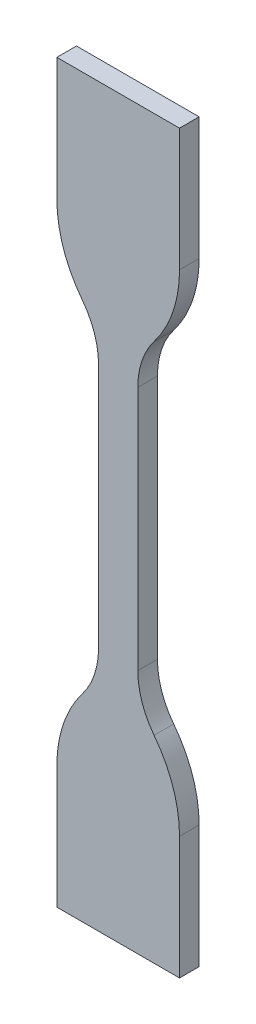
ISO-10303-21;
HEADER;
FILE_DESCRIPTION(('STEP AP214'),'2;1');
FILE_NAME('part.step','',(''),(''),'','','');
FILE_SCHEMA(('AUTOMOTIVE_DESIGN { 1 0 10303 214 1 1 1 1 }'));
ENDSEC;
DATA;
#1=APPLICATION_CONTEXT('core data for automotive mechanical design processes');
#2=APPLICATION_PROTOCOL_DEFINITION('international standard','automotive_design',2000,#1);
#3=PRODUCT_CONTEXT('',#1,'mechanical');
#4=PRODUCT('Part','Part','',(#3));
#5=PRODUCT_RELATED_PRODUCT_CATEGORY('part','',(#4));
#6=PRODUCT_DEFINITION_FORMATION('','',#4);
#7=PRODUCT_DEFINITION_CONTEXT('part definition',#1,'design');
#8=PRODUCT_DEFINITION('design','',#6,#7);
#9=PRODUCT_DEFINITION_SHAPE('','',#8);
#10=(LENGTH_UNIT() NAMED_UNIT(*) SI_UNIT(.MILLI.,.METRE.));
#11=(NAMED_UNIT(*) PLANE_ANGLE_UNIT() SI_UNIT($,.RADIAN.));
#12=(NAMED_UNIT(*) SI_UNIT($,.STERADIAN.) SOLID_ANGLE_UNIT());
#13=UNCERTAINTY_MEASURE_WITH_UNIT(LENGTH_MEASURE(1.E-05),#10,'distance_accuracy_value','');
#14=(GEOMETRIC_REPRESENTATION_CONTEXT(3) GLOBAL_UNCERTAINTY_ASSIGNED_CONTEXT((#13)) GLOBAL_UNIT_ASSIGNED_CONTEXT((#10,
#11,#12)) REPRESENTATION_CONTEXT('',''));
#15=CARTESIAN_POINT('',(0.,0.,0.));
#16=DIRECTION('',(0.,0.,1.));
#17=DIRECTION('',(1.,0.,0.));
#18=AXIS2_PLACEMENT_3D('',#15,#16,#17);
#19=CARTESIAN_POINT('',(10.,12.5,1.));
#20=DIRECTION('',(0.,0.,-1.));
#21=DIRECTION('',(-1.,0.,0.));
#22=AXIS2_PLACEMENT_3D('',#19,#20,#21);
#23=CYLINDRICAL_SURFACE('',#22,8.);
#24=CARTESIAN_POINT('',(10.,12.5,-1.));
#25=DIRECTION('',(0.,0.,-1.));
#26=DIRECTION('',(-1.,0.,0.));
#27=AXIS2_PLACEMENT_3D('',#24,#25,#26);
#28=CIRCLE('',#27,8.);
#29=CARTESIAN_POINT('',(2.,12.5,-1.));
#30=VERTEX_POINT('',#29);
#31=CARTESIAN_POINT('',(3.65853658536585,17.3770730731512,-1.));
#32=VERTEX_POINT('',#31);
#33=EDGE_CURVE('E228',#30,#32,#28,.T.);
#34=ORIENTED_EDGE('',*,*,#33,.T.);
#35=DIRECTION('',(0.,0.,-1.));
#36=VECTOR('',#35,1.);
#37=CARTESIAN_POINT('',(3.65853658536585,17.3770730731512,1.));
#38=LINE('',#37,#36);
#39=CARTESIAN_POINT('',(3.65853658536585,17.3770730731512,1.));
#40=VERTEX_POINT('',#39);
#41=EDGE_CURVE('E11',#32,#40,#38,.F.);
#42=ORIENTED_EDGE('',*,*,#41,.T.);
#43=CARTESIAN_POINT('',(10.,12.5,1.));
#44=DIRECTION('',(0.,0.,-1.));
#45=DIRECTION('',(-1.,0.,0.));
#46=AXIS2_PLACEMENT_3D('',#43,#44,#45);
#47=CIRCLE('',#46,8.);
#48=CARTESIAN_POINT('',(2.,12.5,1.));
#49=VERTEX_POINT('',#48);
#50=EDGE_CURVE('E177',#49,#40,#47,.T.);
#51=ORIENTED_EDGE('',*,*,#50,.F.);
#52=DIRECTION('',(0.,0.,-1.));
#53=VECTOR('',#52,1.);
#54=CARTESIAN_POINT('',(2.,12.5,1.));
#55=LINE('',#54,#53);
#56=EDGE_CURVE('E227',#49,#30,#55,.T.);
#57=ORIENTED_EDGE('',*,*,#56,.T.);
#58=EDGE_LOOP('',(#34,#42,#51,#57));
#59=FACE_BOUND('',#58,.T.);
#60=ADVANCED_FACE('F49',(#59),#23,.F.);
#61=CARTESIAN_POINT('',(6.25,19.5666470125513,1.));
#62=DIRECTION('',(-1.,0.,0.));
#63=DIRECTION('',(0.,0.,1.));
#64=AXIS2_PLACEMENT_3D('',#61,#62,#63);
#65=PLANE('',#64);
#66=DIRECTION('',(0.,1.,0.));
#67=VECTOR('',#66,1.);
#68=CARTESIAN_POINT('',(6.25,19.5666470125513,1.));
#69=LINE('',#68,#67);
#70=CARTESIAN_POINT('',(6.25,24.99749974995,1.));
#71=VERTEX_POINT('',#70);
#72=CARTESIAN_POINT('',(6.25,37.5,1.));
#73=VERTEX_POINT('',#72);
#74=EDGE_CURVE('E162',#71,#73,#69,.T.);
#75=ORIENTED_EDGE('',*,*,#74,.F.);
#76=DIRECTION('',(0.,0.,-1.));
#77=VECTOR('',#76,1.);
#78=CARTESIAN_POINT('',(6.25,24.99749974995,1.));
#79=LINE('',#78,#77);
#80=CARTESIAN_POINT('',(6.25,24.99749974995,-1.));
#81=VERTEX_POINT('',#80);
#82=EDGE_CURVE('E58',#71,#81,#79,.T.);
#83=ORIENTED_EDGE('',*,*,#82,.T.);
#84=DIRECTION('',(0.,1.,0.));
#85=VECTOR('',#84,1.);
#86=CARTESIAN_POINT('',(6.25,19.5666470125513,-1.));
#87=LINE('',#86,#85);
#88=CARTESIAN_POINT('',(6.25,37.5,-1.));
#89=VERTEX_POINT('',#88);
#90=EDGE_CURVE('E183',#81,#89,#87,.T.);
#91=ORIENTED_EDGE('',*,*,#90,.T.);
#92=DIRECTION('',(0.,0.,-1.));
#93=VECTOR('',#92,1.);
#94=CARTESIAN_POINT('',(6.25,37.5,1.));
#95=LINE('',#94,#93);
#96=EDGE_CURVE('E180',#73,#89,#95,.T.);
#97=ORIENTED_EDGE('',*,*,#96,.F.);
#98=EDGE_LOOP('',(#75,#83,#91,#97));
#99=FACE_BOUND('',#98,.T.);
#100=ADVANCED_FACE('F181',(#99),#65,.F.);
#101=CARTESIAN_POINT('',(6.25,37.5,1.));
#102=DIRECTION('',(0.,-1.,0.));
#103=DIRECTION('',(0.,0.,-1.));
#104=AXIS2_PLACEMENT_3D('',#101,#102,#103);
#105=PLANE('',#104);
#106=DIRECTION('',(-1.,0.,0.));
#107=VECTOR('',#106,1.);
#108=CARTESIAN_POINT('',(6.25,37.5,-1.));
#109=LINE('',#108,#107);
#110=CARTESIAN_POINT('',(-6.25,37.5,-1.));
#111=VERTEX_POINT('',#110);
#112=EDGE_CURVE('E234',#89,#111,#109,.T.);
#113=ORIENTED_EDGE('',*,*,#112,.T.);
#114=DIRECTION('',(0.,0.,-1.));
#115=VECTOR('',#114,1.);
#116=CARTESIAN_POINT('',(-6.25,37.5,1.));
#117=LINE('',#116,#115);
#118=CARTESIAN_POINT('',(-6.25,37.5,1.));
#119=VERTEX_POINT('',#118);
#120=EDGE_CURVE('E188',#119,#111,#117,.T.);
#121=ORIENTED_EDGE('',*,*,#120,.F.);
#122=DIRECTION('',(-1.,0.,0.));
#123=VECTOR('',#122,1.);
#124=CARTESIAN_POINT('',(6.25,37.5,1.));
#125=LINE('',#124,#123);
#126=EDGE_CURVE('E168',#73,#119,#125,.T.);
#127=ORIENTED_EDGE('',*,*,#126,.F.);
#128=ORIENTED_EDGE('',*,*,#96,.T.);
#129=EDGE_LOOP('',(#113,#121,#127,#128));
#130=FACE_BOUND('',#129,.T.);
#131=ADVANCED_FACE('F190',(#130),#105,.F.);
#132=CARTESIAN_POINT('',(-6.25,19.5666470125513,1.));
#133=DIRECTION('',(1.,0.,0.));
#134=DIRECTION('',(0.,0.,-1.));
#135=AXIS2_PLACEMENT_3D('',#132,#133,#134);
#136=PLANE('',#135);
#137=DIRECTION('',(0.,-1.,0.));
#138=VECTOR('',#137,1.);
#139=CARTESIAN_POINT('',(-6.25,19.5666470125513,-1.));
#140=LINE('',#139,#138);
#141=CARTESIAN_POINT('',(-6.25,24.99749974995,-1.));
#142=VERTEX_POINT('',#141);
#143=EDGE_CURVE('E237',#111,#142,#140,.T.);
#144=ORIENTED_EDGE('',*,*,#143,.T.);
#145=DIRECTION('',(0.,0.,-1.));
#146=VECTOR('',#145,1.);
#147=CARTESIAN_POINT('',(-6.25,24.99749974995,1.));
#148=LINE('',#147,#146);
#149=CARTESIAN_POINT('',(-6.25,24.99749974995,1.));
#150=VERTEX_POINT('',#149);
#151=EDGE_CURVE('E327',#142,#150,#148,.F.);
#152=ORIENTED_EDGE('',*,*,#151,.T.);
#153=DIRECTION('',(0.,-1.,0.));
#154=VECTOR('',#153,1.);
#155=CARTESIAN_POINT('',(-6.25,19.5666470125513,1.));
#156=LINE('',#155,#154);
#157=EDGE_CURVE('E194',#119,#150,#156,.T.);
#158=ORIENTED_EDGE('',*,*,#157,.F.);
#159=ORIENTED_EDGE('',*,*,#120,.T.);
#160=EDGE_LOOP('',(#144,#152,#158,#159));
#161=FACE_BOUND('',#160,.T.);
#162=ADVANCED_FACE('F339',(#161),#136,.F.);
#163=CARTESIAN_POINT('',(-10.,12.5,1.));
#164=DIRECTION('',(0.,0.,-1.));
#165=DIRECTION('',(-1.,0.,0.));
#166=AXIS2_PLACEMENT_3D('',#163,#164,#165);
#167=CYLINDRICAL_SURFACE('',#166,8.);
#168=CARTESIAN_POINT('',(-10.,12.5,1.));
#169=DIRECTION('',(0.,0.,-1.));
#170=DIRECTION('',(1.,0.,0.));
#171=AXIS2_PLACEMENT_3D('',#168,#169,#170);
#172=CIRCLE('',#171,8.);
#173=CARTESIAN_POINT('',(-3.65853658536585,17.3770730731512,1.));
#174=VERTEX_POINT('',#173);
#175=CARTESIAN_POINT('',(-2.,12.5,1.));
#176=VERTEX_POINT('',#175);
#177=EDGE_CURVE('E200',#174,#176,#172,.T.);
#178=ORIENTED_EDGE('',*,*,#177,.F.);
#179=DIRECTION('',(0.,0.,-1.));
#180=VECTOR('',#179,1.);
#181=CARTESIAN_POINT('',(-3.65853658536585,17.3770730731512,1.));
#182=LINE('',#181,#180);
#183=CARTESIAN_POINT('',(-3.65853658536585,17.3770730731512,-1.));
#184=VERTEX_POINT('',#183);
#185=EDGE_CURVE('E323',#174,#184,#182,.T.);
#186=ORIENTED_EDGE('',*,*,#185,.T.);
#187=CARTESIAN_POINT('',(-10.,12.5,-1.));
#188=DIRECTION('',(0.,0.,-1.));
#189=DIRECTION('',(1.,0.,0.));
#190=AXIS2_PLACEMENT_3D('',#187,#188,#189);
#191=CIRCLE('',#190,8.);
#192=CARTESIAN_POINT('',(-2.,12.5,-1.));
#193=VERTEX_POINT('',#192);
#194=EDGE_CURVE('E241',#184,#193,#191,.T.);
#195=ORIENTED_EDGE('',*,*,#194,.T.);
#196=DIRECTION('',(0.,0.,-1.));
#197=VECTOR('',#196,1.);
#198=CARTESIAN_POINT('',(-2.,12.5,1.));
#199=LINE('',#198,#197);
#200=EDGE_CURVE('E284',#176,#193,#199,.T.);
#201=ORIENTED_EDGE('',*,*,#200,.F.);
#202=EDGE_LOOP('',(#178,#186,#195,#201));
#203=FACE_BOUND('',#202,.T.);
#204=ADVANCED_FACE('F348',(#203),#167,.F.);
#205=CARTESIAN_POINT('',(-2.,-12.5,1.));
#206=DIRECTION('',(1.,0.,0.));
#207=DIRECTION('',(0.,1.,0.));
#208=AXIS2_PLACEMENT_3D('',#205,#206,#207);
#209=PLANE('',#208);
#210=DIRECTION('',(0.,-1.,0.));
#211=VECTOR('',#210,1.);
#212=CARTESIAN_POINT('',(-2.,-12.5,-1.));
#213=LINE('',#212,#211);
#214=CARTESIAN_POINT('',(-2.,-12.5,-1.));
#215=VERTEX_POINT('',#214);
#216=EDGE_CURVE('E243',#193,#215,#213,.T.);
#217=ORIENTED_EDGE('',*,*,#216,.T.);
#218=DIRECTION('',(0.,0.,-1.));
#219=VECTOR('',#218,1.);
#220=CARTESIAN_POINT('',(-2.,-12.5,1.));
#221=LINE('',#220,#219);
#222=CARTESIAN_POINT('',(-2.,-12.5,1.));
#223=VERTEX_POINT('',#222);
#224=EDGE_CURVE('E280',#223,#215,#221,.T.);
#225=ORIENTED_EDGE('',*,*,#224,.F.);
#226=DIRECTION('',(0.,-1.,0.));
#227=VECTOR('',#226,1.);
#228=CARTESIAN_POINT('',(-2.,-12.5,1.));
#229=LINE('',#228,#227);
#230=EDGE_CURVE('E206',#176,#223,#229,.T.);
#231=ORIENTED_EDGE('',*,*,#230,.F.);
#232=ORIENTED_EDGE('',*,*,#200,.T.);
#233=EDGE_LOOP('',(#217,#225,#231,#232));
#234=FACE_BOUND('',#233,.T.);
#235=ADVANCED_FACE('F354',(#234),#209,.F.);
#236=CARTESIAN_POINT('',(-9.99999999999999,-12.5,1.));
#237=DIRECTION('',(0.,0.,-1.));
#238=DIRECTION('',(-1.,0.,0.));
#239=AXIS2_PLACEMENT_3D('',#236,#237,#238);
#240=CYLINDRICAL_SURFACE('',#239,8.);
#241=CARTESIAN_POINT('',(-9.99999999999999,-12.5,-1.));
#242=DIRECTION('',(0.,0.,-1.));
#243=DIRECTION('',(-1.,0.,0.));
#244=AXIS2_PLACEMENT_3D('',#241,#242,#243);
#245=CIRCLE('',#244,8.);
#246=CARTESIAN_POINT('',(-3.65853658536585,-17.3770730731512,-1.));
#247=VERTEX_POINT('',#246);
#248=EDGE_CURVE('E246',#215,#247,#245,.T.);
#249=ORIENTED_EDGE('',*,*,#248,.T.);
#250=DIRECTION('',(0.,0.,-1.));
#251=VECTOR('',#250,1.);
#252=CARTESIAN_POINT('',(-3.65853658536585,-17.3770730731512,1.));
#253=LINE('',#252,#251);
#254=CARTESIAN_POINT('',(-3.65853658536585,-17.3770730731512,1.));
#255=VERTEX_POINT('',#254);
#256=EDGE_CURVE('E305',#247,#255,#253,.F.);
#257=ORIENTED_EDGE('',*,*,#256,.T.);
#258=CARTESIAN_POINT('',(-9.99999999999999,-12.5,1.));
#259=DIRECTION('',(0.,0.,-1.));
#260=DIRECTION('',(-1.,0.,0.));
#261=AXIS2_PLACEMENT_3D('',#258,#259,#260);
#262=CIRCLE('',#261,8.);
#263=EDGE_CURVE('E209',#223,#255,#262,.T.);
#264=ORIENTED_EDGE('',*,*,#263,.F.);
#265=ORIENTED_EDGE('',*,*,#224,.T.);
#266=EDGE_LOOP('',(#249,#257,#264,#265));
#267=FACE_BOUND('',#266,.T.);
#268=ADVANCED_FACE('F358',(#267),#240,.F.);
#269=CARTESIAN_POINT('',(-6.25,-19.5666470125513,1.));
#270=DIRECTION('',(1.,0.,0.));
#271=DIRECTION('',(0.,1.,0.));
#272=AXIS2_PLACEMENT_3D('',#269,#270,#271);
#273=PLANE('',#272);
#274=DIRECTION('',(0.,-1.,0.));
#275=VECTOR('',#274,1.);
#276=CARTESIAN_POINT('',(-6.25,-19.5666470125513,1.));
#277=LINE('',#276,#275);
#278=CARTESIAN_POINT('',(-6.24999999999999,-24.99749974995,1.));
#279=VERTEX_POINT('',#278);
#280=CARTESIAN_POINT('',(-6.24999999999999,-37.5,1.));
#281=VERTEX_POINT('',#280);
#282=EDGE_CURVE('E212',#279,#281,#277,.T.);
#283=ORIENTED_EDGE('',*,*,#282,.F.);
#284=DIRECTION('',(0.,0.,-1.));
#285=VECTOR('',#284,1.);
#286=CARTESIAN_POINT('',(-6.24999999999999,-24.99749974995,1.));
#287=LINE('',#286,#285);
#288=CARTESIAN_POINT('',(-6.24999999999999,-24.99749974995,-1.));
#289=VERTEX_POINT('',#288);
#290=EDGE_CURVE('E187',#279,#289,#287,.T.);
#291=ORIENTED_EDGE('',*,*,#290,.T.);
#292=DIRECTION('',(0.,-1.,0.));
#293=VECTOR('',#292,1.);
#294=CARTESIAN_POINT('',(-6.25,-19.5666470125513,-1.));
#295=LINE('',#294,#293);
#296=CARTESIAN_POINT('',(-6.24999999999999,-37.5,-1.));
#297=VERTEX_POINT('',#296);
#298=EDGE_CURVE('E250',#289,#297,#295,.T.);
#299=ORIENTED_EDGE('',*,*,#298,.T.);
#300=DIRECTION('',(0.,0.,-1.));
#301=VECTOR('',#300,1.);
#302=CARTESIAN_POINT('',(-6.24999999999999,-37.5,1.));
#303=LINE('',#302,#301);
#304=EDGE_CURVE('E276',#281,#297,#303,.T.);
#305=ORIENTED_EDGE('',*,*,#304,.F.);
#306=EDGE_LOOP('',(#283,#291,#299,#305));
#307=FACE_BOUND('',#306,.T.);
#308=ADVANCED_FACE('F366',(#307),#273,.F.);
#309=CARTESIAN_POINT('',(6.25000000000001,-37.5,1.));
#310=DIRECTION('',(0.,1.,0.));
#311=DIRECTION('',(0.,0.,1.));
#312=AXIS2_PLACEMENT_3D('',#309,#310,#311);
#313=PLANE('',#312);
#314=DIRECTION('',(1.,0.,0.));
#315=VECTOR('',#314,1.);
#316=CARTESIAN_POINT('',(6.25000000000001,-37.5,-1.));
#317=LINE('',#316,#315);
#318=CARTESIAN_POINT('',(6.25000000000001,-37.5,-1.));
#319=VERTEX_POINT('',#318);
#320=EDGE_CURVE('E253',#297,#319,#317,.T.);
#321=ORIENTED_EDGE('',*,*,#320,.T.);
#322=DIRECTION('',(0.,0.,-1.));
#323=VECTOR('',#322,1.);
#324=CARTESIAN_POINT('',(6.25000000000001,-37.5,1.));
#325=LINE('',#324,#323);
#326=CARTESIAN_POINT('',(6.25000000000001,-37.5,1.));
#327=VERTEX_POINT('',#326);
#328=EDGE_CURVE('E272',#327,#319,#325,.T.);
#329=ORIENTED_EDGE('',*,*,#328,.F.);
#330=DIRECTION('',(1.,0.,0.));
#331=VECTOR('',#330,1.);
#332=CARTESIAN_POINT('',(6.25000000000001,-37.5,1.));
#333=LINE('',#332,#331);
#334=EDGE_CURVE('E215',#281,#327,#333,.T.);
#335=ORIENTED_EDGE('',*,*,#334,.F.);
#336=ORIENTED_EDGE('',*,*,#304,.T.);
#337=EDGE_LOOP('',(#321,#329,#335,#336));
#338=FACE_BOUND('',#337,.T.);
#339=ADVANCED_FACE('F372',(#338),#313,.F.);
#340=CARTESIAN_POINT('',(6.25000000000001,-19.5666470125513,1.));
#341=DIRECTION('',(-1.,0.,0.));
#342=DIRECTION('',(0.,-1.,0.));
#343=AXIS2_PLACEMENT_3D('',#340,#341,#342);
#344=PLANE('',#343);
#345=DIRECTION('',(0.,1.,0.));
#346=VECTOR('',#345,1.);
#347=CARTESIAN_POINT('',(6.25000000000001,-19.5666470125513,-1.));
#348=LINE('',#347,#346);
#349=CARTESIAN_POINT('',(6.25000000000001,-24.99749974995,-1.));
#350=VERTEX_POINT('',#349);
#351=EDGE_CURVE('E256',#319,#350,#348,.T.);
#352=ORIENTED_EDGE('',*,*,#351,.T.);
#353=DIRECTION('',(0.,0.,-1.));
#354=VECTOR('',#353,1.);
#355=CARTESIAN_POINT('',(6.25000000000001,-24.99749974995,1.));
#356=LINE('',#355,#354);
#357=CARTESIAN_POINT('',(6.25000000000001,-24.99749974995,1.));
#358=VERTEX_POINT('',#357);
#359=EDGE_CURVE('E73',#350,#358,#356,.F.);
#360=ORIENTED_EDGE('',*,*,#359,.T.);
#361=DIRECTION('',(0.,1.,0.));
#362=VECTOR('',#361,1.);
#363=CARTESIAN_POINT('',(6.25000000000001,-19.5666470125513,1.));
#364=LINE('',#363,#362);
#365=EDGE_CURVE('E218',#327,#358,#364,.T.);
#366=ORIENTED_EDGE('',*,*,#365,.F.);
#367=ORIENTED_EDGE('',*,*,#328,.T.);
#368=EDGE_LOOP('',(#352,#360,#366,#367));
#369=FACE_BOUND('',#368,.T.);
#370=ADVANCED_FACE('F374',(#369),#344,.F.);
#371=CARTESIAN_POINT('',(10.,-12.5,1.));
#372=DIRECTION('',(0.,0.,-1.));
#373=DIRECTION('',(-1.,0.,0.));
#374=AXIS2_PLACEMENT_3D('',#371,#372,#373);
#375=CYLINDRICAL_SURFACE('',#374,8.);
#376=CARTESIAN_POINT('',(10.,-12.5,1.));
#377=DIRECTION('',(0.,0.,-1.));
#378=DIRECTION('',(1.,0.,0.));
#379=AXIS2_PLACEMENT_3D('',#376,#377,#378);
#380=CIRCLE('',#379,8.);
#381=CARTESIAN_POINT('',(3.65853658536586,-17.3770730731512,1.));
#382=VERTEX_POINT('',#381);
#383=CARTESIAN_POINT('',(2.,-12.5,1.));
#384=VERTEX_POINT('',#383);
#385=EDGE_CURVE('E221',#382,#384,#380,.T.);
#386=ORIENTED_EDGE('',*,*,#385,.F.);
#387=DIRECTION('',(0.,0.,-1.));
#388=VECTOR('',#387,1.);
#389=CARTESIAN_POINT('',(3.65853658536586,-17.3770730731512,1.));
#390=LINE('',#389,#388);
#391=CARTESIAN_POINT('',(3.65853658536586,-17.3770730731512,-1.));
#392=VERTEX_POINT('',#391);
#393=EDGE_CURVE('E317',#382,#392,#390,.T.);
#394=ORIENTED_EDGE('',*,*,#393,.T.);
#395=CARTESIAN_POINT('',(10.,-12.5,-1.));
#396=DIRECTION('',(0.,0.,-1.));
#397=DIRECTION('',(1.,0.,0.));
#398=AXIS2_PLACEMENT_3D('',#395,#396,#397);
#399=CIRCLE('',#398,8.);
#400=CARTESIAN_POINT('',(2.,-12.5,-1.));
#401=VERTEX_POINT('',#400);
#402=EDGE_CURVE('E259',#392,#401,#399,.T.);
#403=ORIENTED_EDGE('',*,*,#402,.T.);
#404=DIRECTION('',(0.,0.,-1.));
#405=VECTOR('',#404,1.);
#406=CARTESIAN_POINT('',(2.,-12.5,1.));
#407=LINE('',#406,#405);
#408=EDGE_CURVE('E268',#384,#401,#407,.T.);
#409=ORIENTED_EDGE('',*,*,#408,.F.);
#410=EDGE_LOOP('',(#386,#394,#403,#409));
#411=FACE_BOUND('',#410,.T.);
#412=ADVANCED_FACE('F380',(#411),#375,.F.);
#413=CARTESIAN_POINT('',(2.,-12.5,1.));
#414=DIRECTION('',(-1.,0.,0.));
#415=DIRECTION('',(0.,-1.,0.));
#416=AXIS2_PLACEMENT_3D('',#413,#414,#415);
#417=PLANE('',#416);
#418=DIRECTION('',(0.,1.,0.));
#419=VECTOR('',#418,1.);
#420=CARTESIAN_POINT('',(2.,-12.5,-1.));
#421=LINE('',#420,#419);
#422=EDGE_CURVE('E262',#401,#30,#421,.T.);
#423=ORIENTED_EDGE('',*,*,#422,.T.);
#424=ORIENTED_EDGE('',*,*,#56,.F.);
#425=DIRECTION('',(0.,1.,0.));
#426=VECTOR('',#425,1.);
#427=CARTESIAN_POINT('',(2.,-12.5,1.));
#428=LINE('',#427,#426);
#429=EDGE_CURVE('E224',#384,#49,#428,.T.);
#430=ORIENTED_EDGE('',*,*,#429,.F.);
#431=ORIENTED_EDGE('',*,*,#408,.T.);
#432=EDGE_LOOP('',(#423,#424,#430,#431));
#433=FACE_BOUND('',#432,.T.);
#434=ADVANCED_FACE('F385',(#433),#417,.F.);
#435=CARTESIAN_POINT('',(10.,12.5,1.));
#436=DIRECTION('',(0.,0.,-1.));
#437=DIRECTION('',(-1.,0.,0.));
#438=AXIS2_PLACEMENT_3D('',#435,#436,#437);
#439=PLANE('',#438);
#440=ORIENTED_EDGE('',*,*,#263,.T.);
#441=CARTESIAN_POINT('',(6.25000000000001,-24.99749974995,1.));
#442=DIRECTION('',(0.,0.,-1.));
#443=DIRECTION('',(-1.,0.,0.));
#444=AXIS2_PLACEMENT_3D('',#441,#442,#443);
#445=CIRCLE('',#444,12.5);
#446=EDGE_CURVE('E314',#255,#279,#445,.F.);
#447=ORIENTED_EDGE('',*,*,#446,.T.);
#448=ORIENTED_EDGE('',*,*,#282,.T.);
#449=ORIENTED_EDGE('',*,*,#334,.T.);
#450=ORIENTED_EDGE('',*,*,#365,.T.);
#451=CARTESIAN_POINT('',(-6.24999999999999,-24.99749974995,1.));
#452=DIRECTION('',(0.,0.,-1.));
#453=DIRECTION('',(-1.,0.,0.));
#454=AXIS2_PLACEMENT_3D('',#451,#452,#453);
#455=CIRCLE('',#454,12.5);
#456=EDGE_CURVE('E65',#358,#382,#455,.F.);
#457=ORIENTED_EDGE('',*,*,#456,.T.);
#458=ORIENTED_EDGE('',*,*,#385,.T.);
#459=ORIENTED_EDGE('',*,*,#429,.T.);
#460=ORIENTED_EDGE('',*,*,#50,.T.);
#461=CARTESIAN_POINT('',(-6.25,24.99749974995,1.));
#462=DIRECTION('',(0.,0.,-1.));
#463=DIRECTION('',(-1.,0.,0.));
#464=AXIS2_PLACEMENT_3D('',#461,#462,#463);
#465=CIRCLE('',#464,12.5);
#466=EDGE_CURVE('E172',#40,#71,#465,.F.);
#467=ORIENTED_EDGE('',*,*,#466,.T.);
#468=ORIENTED_EDGE('',*,*,#74,.T.);
#469=ORIENTED_EDGE('',*,*,#126,.T.);
#470=ORIENTED_EDGE('',*,*,#157,.T.);
#471=CARTESIAN_POINT('',(6.25,24.99749974995,1.));
#472=DIRECTION('',(0.,0.,-1.));
#473=DIRECTION('',(-1.,0.,0.));
#474=AXIS2_PLACEMENT_3D('',#471,#472,#473);
#475=CIRCLE('',#474,12.5);
#476=EDGE_CURVE('E310',#150,#174,#475,.F.);
#477=ORIENTED_EDGE('',*,*,#476,.T.);
#478=ORIENTED_EDGE('',*,*,#177,.T.);
#479=ORIENTED_EDGE('',*,*,#230,.T.);
#480=EDGE_LOOP('',(#440,#447,#448,#449,#450,#457,#458,#459,#460,#467,#468,#469,#470,#477,#478,#479));
#481=FACE_BOUND('',#480,.T.);
#482=ADVANCED_FACE('F165',(#481),#439,.F.);
#483=CARTESIAN_POINT('',(10.,12.5,-1.));
#484=DIRECTION('',(0.,0.,-1.));
#485=DIRECTION('',(-1.,0.,0.));
#486=AXIS2_PLACEMENT_3D('',#483,#484,#485);
#487=PLANE('',#486);
#488=ORIENTED_EDGE('',*,*,#298,.F.);
#489=CARTESIAN_POINT('',(6.25000000000001,-24.99749974995,-1.));
#490=DIRECTION('',(0.,0.,-1.));
#491=DIRECTION('',(-1.,0.,0.));
#492=AXIS2_PLACEMENT_3D('',#489,#490,#491);
#493=CIRCLE('',#492,12.5);
#494=EDGE_CURVE('E302',#289,#247,#493,.T.);
#495=ORIENTED_EDGE('',*,*,#494,.T.);
#496=ORIENTED_EDGE('',*,*,#248,.F.);
#497=ORIENTED_EDGE('',*,*,#216,.F.);
#498=ORIENTED_EDGE('',*,*,#194,.F.);
#499=CARTESIAN_POINT('',(6.25,24.99749974995,-1.));
#500=DIRECTION('',(0.,0.,-1.));
#501=DIRECTION('',(-1.,0.,0.));
#502=AXIS2_PLACEMENT_3D('',#499,#500,#501);
#503=CIRCLE('',#502,12.5);
#504=EDGE_CURVE('E296',#184,#142,#503,.T.);
#505=ORIENTED_EDGE('',*,*,#504,.T.);
#506=ORIENTED_EDGE('',*,*,#143,.F.);
#507=ORIENTED_EDGE('',*,*,#112,.F.);
#508=ORIENTED_EDGE('',*,*,#90,.F.);
#509=CARTESIAN_POINT('',(-6.25,24.99749974995,-1.));
#510=DIRECTION('',(0.,0.,-1.));
#511=DIRECTION('',(-1.,0.,0.));
#512=AXIS2_PLACEMENT_3D('',#509,#510,#511);
#513=CIRCLE('',#512,12.5);
#514=EDGE_CURVE('E293',#81,#32,#513,.T.);
#515=ORIENTED_EDGE('',*,*,#514,.T.);
#516=ORIENTED_EDGE('',*,*,#33,.F.);
#517=ORIENTED_EDGE('',*,*,#422,.F.);
#518=ORIENTED_EDGE('',*,*,#402,.F.);
#519=CARTESIAN_POINT('',(-6.24999999999999,-24.99749974995,-1.));
#520=DIRECTION('',(0.,0.,-1.));
#521=DIRECTION('',(-1.,0.,0.));
#522=AXIS2_PLACEMENT_3D('',#519,#520,#521);
#523=CIRCLE('',#522,12.5);
#524=EDGE_CURVE('E299',#392,#350,#523,.T.);
#525=ORIENTED_EDGE('',*,*,#524,.T.);
#526=ORIENTED_EDGE('',*,*,#351,.F.);
#527=ORIENTED_EDGE('',*,*,#320,.F.);
#528=EDGE_LOOP('',(#488,#495,#496,#497,#498,#505,#506,#507,#508,#515,#516,#517,#518,#525,#526,#527));
#529=FACE_BOUND('',#528,.T.);
#530=ADVANCED_FACE('F335',(#529),#487,.T.);
#531=CARTESIAN_POINT('',(6.25000000000001,-24.99749974995,1.));
#532=DIRECTION('',(0.,0.,-1.));
#533=DIRECTION('',(-1.,0.,0.));
#534=AXIS2_PLACEMENT_3D('',#531,#532,#533);
#535=CYLINDRICAL_SURFACE('',#534,12.5);
#536=ORIENTED_EDGE('',*,*,#446,.F.);
#537=ORIENTED_EDGE('',*,*,#256,.F.);
#538=ORIENTED_EDGE('',*,*,#494,.F.);
#539=ORIENTED_EDGE('',*,*,#290,.F.);
#540=EDGE_LOOP('',(#536,#537,#538,#539));
#541=FACE_BOUND('',#540,.T.);
#542=ADVANCED_FACE('F364',(#541),#535,.T.);
#543=CARTESIAN_POINT('',(-6.24999999999999,-24.99749974995,1.));
#544=DIRECTION('',(0.,0.,-1.));
#545=DIRECTION('',(-1.,0.,0.));
#546=AXIS2_PLACEMENT_3D('',#543,#544,#545);
#547=CYLINDRICAL_SURFACE('',#546,12.5);
#548=ORIENTED_EDGE('',*,*,#456,.F.);
#549=ORIENTED_EDGE('',*,*,#359,.F.);
#550=ORIENTED_EDGE('',*,*,#524,.F.);
#551=ORIENTED_EDGE('',*,*,#393,.F.);
#552=EDGE_LOOP('',(#548,#549,#550,#551));
#553=FACE_BOUND('',#552,.T.);
#554=ADVANCED_FACE('F377',(#553),#547,.T.);
#555=CARTESIAN_POINT('',(6.25,24.99749974995,1.));
#556=DIRECTION('',(0.,0.,-1.));
#557=DIRECTION('',(-1.,0.,0.));
#558=AXIS2_PLACEMENT_3D('',#555,#556,#557);
#559=CYLINDRICAL_SURFACE('',#558,12.5);
#560=ORIENTED_EDGE('',*,*,#476,.F.);
#561=ORIENTED_EDGE('',*,*,#151,.F.);
#562=ORIENTED_EDGE('',*,*,#504,.F.);
#563=ORIENTED_EDGE('',*,*,#185,.F.);
#564=EDGE_LOOP('',(#560,#561,#562,#563));
#565=FACE_BOUND('',#564,.T.);
#566=ADVANCED_FACE('F345',(#565),#559,.T.);
#567=CARTESIAN_POINT('',(-6.25,24.99749974995,1.));
#568=DIRECTION('',(0.,0.,-1.));
#569=DIRECTION('',(-1.,0.,0.));
#570=AXIS2_PLACEMENT_3D('',#567,#568,#569);
#571=CYLINDRICAL_SURFACE('',#570,12.5);
#572=ORIENTED_EDGE('',*,*,#466,.F.);
#573=ORIENTED_EDGE('',*,*,#41,.F.);
#574=ORIENTED_EDGE('',*,*,#514,.F.);
#575=ORIENTED_EDGE('',*,*,#82,.F.);
#576=EDGE_LOOP('',(#572,#573,#574,#575));
#577=FACE_BOUND('',#576,.T.);
#578=ADVANCED_FACE('F51',(#577),#571,.T.);
#579=CLOSED_SHELL('',(#60,#100,#131,#162,#204,#235,#268,#308,#339,#370,#412,#434,#482,#530,#542,
#554,#566,#578));
#580=MANIFOLD_SOLID_BREP('B2',#579);
#581=ADVANCED_BREP_SHAPE_REPRESENTATION('',(#18,#580),#14);
#582=SHAPE_DEFINITION_REPRESENTATION(#9,#581);
ENDSEC;
END-ISO-10303-21;
